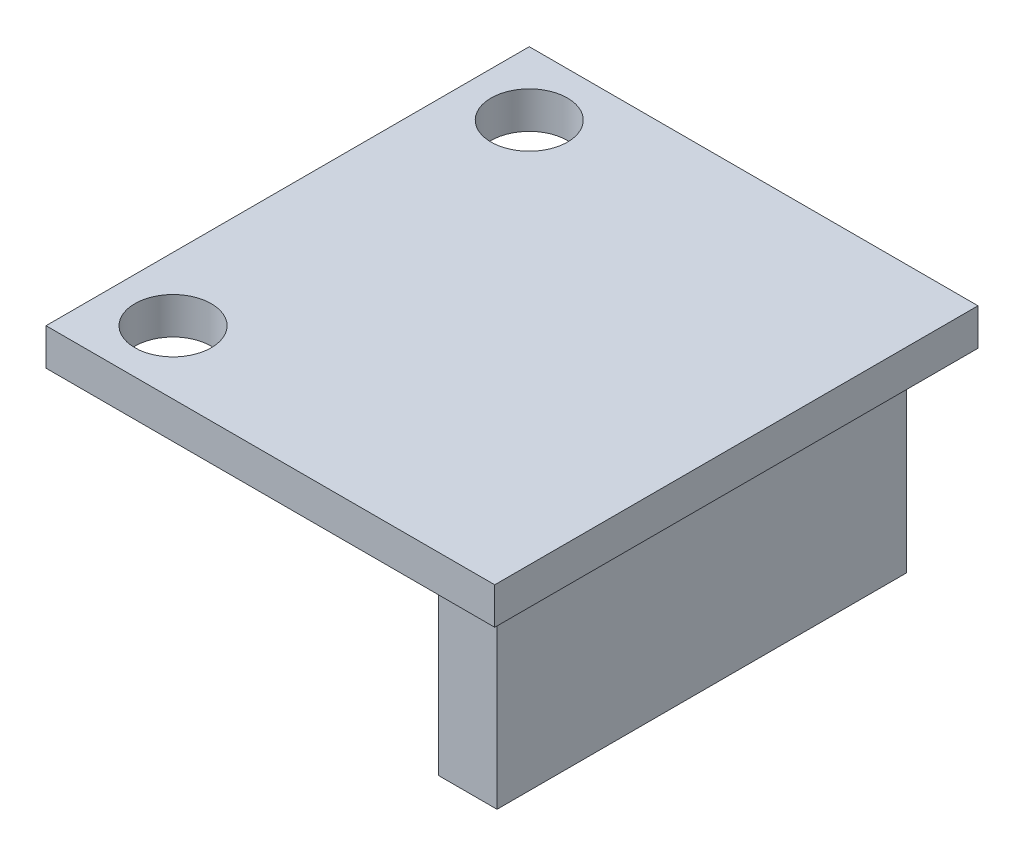
ISO-10303-21;
HEADER;
FILE_DESCRIPTION(('STEP AP214'),'2;1');
FILE_NAME('part.step','',(''),(''),'','','');
FILE_SCHEMA(('AUTOMOTIVE_DESIGN { 1 0 10303 214 1 1 1 1 }'));
ENDSEC;
DATA;
#1=APPLICATION_CONTEXT('core data for automotive mechanical design processes');
#2=APPLICATION_PROTOCOL_DEFINITION('international standard','automotive_design',2000,#1);
#3=PRODUCT_CONTEXT('',#1,'mechanical');
#4=PRODUCT('Part','Part','',(#3));
#5=PRODUCT_RELATED_PRODUCT_CATEGORY('part','',(#4));
#6=PRODUCT_DEFINITION_FORMATION('','',#4);
#7=PRODUCT_DEFINITION_CONTEXT('part definition',#1,'design');
#8=PRODUCT_DEFINITION('design','',#6,#7);
#9=PRODUCT_DEFINITION_SHAPE('','',#8);
#10=(LENGTH_UNIT() NAMED_UNIT(*) SI_UNIT(.MILLI.,.METRE.));
#11=(NAMED_UNIT(*) PLANE_ANGLE_UNIT() SI_UNIT($,.RADIAN.));
#12=(NAMED_UNIT(*) SI_UNIT($,.STERADIAN.) SOLID_ANGLE_UNIT());
#13=UNCERTAINTY_MEASURE_WITH_UNIT(LENGTH_MEASURE(1.E-05),#10,'distance_accuracy_value','');
#14=(GEOMETRIC_REPRESENTATION_CONTEXT(3) GLOBAL_UNCERTAINTY_ASSIGNED_CONTEXT((#13)) GLOBAL_UNIT_ASSIGNED_CONTEXT((#10,
#11,#12)) REPRESENTATION_CONTEXT('',''));
#15=CARTESIAN_POINT('',(0.,0.,0.));
#16=DIRECTION('',(0.,0.,1.));
#17=DIRECTION('',(1.,0.,0.));
#18=AXIS2_PLACEMENT_3D('',#15,#16,#17);
#19=CARTESIAN_POINT('',(-28.3332722708799,0.,-5.09343124696711));
#20=DIRECTION('',(0.,-1.,0.));
#21=DIRECTION('',(0.,0.,-1.));
#22=AXIS2_PLACEMENT_3D('',#19,#20,#21);
#23=PLANE('',#22);
#24=CARTESIAN_POINT('',(-25.5725722527087,0.,-2.33273122879591));
#25=DIRECTION('',(0.,1.,0.));
#26=DIRECTION('',(0.,0.,-1.));
#27=AXIS2_PLACEMENT_3D('',#24,#25,#26);
#28=CIRCLE('',#27,1.66070001817121);
#29=CARTESIAN_POINT('',(-25.5725722527087,0.,-3.99343124696712));
#30=VERTEX_POINT('',#29);
#31=EDGE_CURVE('E130',#30,#30,#28,.T.);
#32=ORIENTED_EDGE('',*,*,#31,.T.);
#33=EDGE_LOOP('',(#32));
#34=FACE_BOUND('',#33,.T.);
#35=DIRECTION('',(0.,0.,1.));
#36=VECTOR('',#35,1.);
#37=CARTESIAN_POINT('',(-28.3332722708799,0.,15.9065686630329));
#38=LINE('',#37,#36);
#39=CARTESIAN_POINT('',(-28.3332722708799,0.,-5.09343124696711));
#40=VERTEX_POINT('',#39);
#41=CARTESIAN_POINT('',(-28.3332722708799,0.,15.9065686630329));
#42=VERTEX_POINT('',#41);
#43=EDGE_CURVE('E144',#40,#42,#38,.T.);
#44=ORIENTED_EDGE('',*,*,#43,.F.);
#45=DIRECTION('',(-1.,0.,0.));
#46=VECTOR('',#45,1.);
#47=CARTESIAN_POINT('',(-28.3332722708799,0.,-5.09343124696711));
#48=LINE('',#47,#46);
#49=CARTESIAN_POINT('',(-8.83327227087986,0.,-5.09343124696711));
#50=VERTEX_POINT('',#49);
#51=EDGE_CURVE('E76',#50,#40,#48,.T.);
#52=ORIENTED_EDGE('',*,*,#51,.F.);
#53=DIRECTION('',(0.,0.,-1.));
#54=VECTOR('',#53,1.);
#55=CARTESIAN_POINT('',(-8.83327227087986,0.,15.9065686630329));
#56=LINE('',#55,#54);
#57=CARTESIAN_POINT('',(-8.83327227087986,0.,15.9065686630329));
#58=VERTEX_POINT('',#57);
#59=EDGE_CURVE('E158',#58,#50,#56,.T.);
#60=ORIENTED_EDGE('',*,*,#59,.F.);
#61=DIRECTION('',(1.,0.,0.));
#62=VECTOR('',#61,1.);
#63=CARTESIAN_POINT('',(-28.3332722708799,0.,15.9065686630329));
#64=LINE('',#63,#62);
#65=EDGE_CURVE('E156',#42,#58,#64,.T.);
#66=ORIENTED_EDGE('',*,*,#65,.F.);
#67=EDGE_LOOP('',(#44,#52,#60,#66));
#68=FACE_BOUND('',#67,.T.);
#69=CARTESIAN_POINT('',(-25.5725722527087,0.,13.1458686448617));
#70=DIRECTION('',(0.,1.,0.));
#71=DIRECTION('',(0.,0.,1.));
#72=AXIS2_PLACEMENT_3D('',#69,#70,#71);
#73=CIRCLE('',#72,1.66070001817121);
#74=CARTESIAN_POINT('',(-25.5725722527087,0.,14.8065686630329));
#75=VERTEX_POINT('',#74);
#76=EDGE_CURVE('E139',#75,#75,#73,.T.);
#77=ORIENTED_EDGE('',*,*,#76,.T.);
#78=EDGE_LOOP('',(#77));
#79=FACE_BOUND('',#78,.T.);
#80=DIRECTION('',(-1.,0.,0.));
#81=VECTOR('',#80,1.);
#82=CARTESIAN_POINT('',(-10.3332722708799,0.,14.3065687080329));
#83=LINE('',#82,#81);
#84=CARTESIAN_POINT('',(-10.3332722708799,0.,14.3065687080329));
#85=VERTEX_POINT('',#84);
#86=CARTESIAN_POINT('',(-12.8732722708799,0.,14.3065687080329));
#87=VERTEX_POINT('',#86);
#88=EDGE_CURVE('E296',#85,#87,#83,.T.);
#89=ORIENTED_EDGE('',*,*,#88,.F.);
#90=DIRECTION('',(0.,0.,1.));
#91=VECTOR('',#90,1.);
#92=CARTESIAN_POINT('',(-10.3332722708799,0.,14.3065687080329));
#93=LINE('',#92,#91);
#94=CARTESIAN_POINT('',(-10.3332722708799,0.,-3.49343129196711));
#95=VERTEX_POINT('',#94);
#96=EDGE_CURVE('E128',#95,#85,#93,.T.);
#97=ORIENTED_EDGE('',*,*,#96,.F.);
#98=DIRECTION('',(1.,0.,0.));
#99=VECTOR('',#98,1.);
#100=CARTESIAN_POINT('',(-10.3332722708799,0.,-3.49343129196711));
#101=LINE('',#100,#99);
#102=CARTESIAN_POINT('',(-12.8732722708799,0.,-3.49343129196711));
#103=VERTEX_POINT('',#102);
#104=EDGE_CURVE('E124',#103,#95,#101,.T.);
#105=ORIENTED_EDGE('',*,*,#104,.F.);
#106=DIRECTION('',(0.,0.,-1.));
#107=VECTOR('',#106,1.);
#108=CARTESIAN_POINT('',(-12.8732722708799,0.,14.3065687080329));
#109=LINE('',#108,#107);
#110=EDGE_CURVE('E293',#87,#103,#109,.T.);
#111=ORIENTED_EDGE('',*,*,#110,.F.);
#112=EDGE_LOOP('',(#89,#97,#105,#111));
#113=FACE_BOUND('',#112,.T.);
#114=ADVANCED_FACE('F31',(#34,#68,#79,#113),#23,.T.);
#115=CARTESIAN_POINT('',(-28.3332722708799,1.6,-5.09343124696711));
#116=DIRECTION('',(0.,-1.,0.));
#117=DIRECTION('',(0.,0.,-1.));
#118=AXIS2_PLACEMENT_3D('',#115,#116,#117);
#119=PLANE('',#118);
#120=CARTESIAN_POINT('',(-25.5725722527087,1.6,13.1458686448617));
#121=DIRECTION('',(0.,1.,0.));
#122=DIRECTION('',(0.,0.,1.));
#123=AXIS2_PLACEMENT_3D('',#120,#121,#122);
#124=CIRCLE('',#123,1.66070001817121);
#125=CARTESIAN_POINT('',(-25.5725722527087,1.6,14.8065686630329));
#126=VERTEX_POINT('',#125);
#127=EDGE_CURVE('E141',#126,#126,#124,.T.);
#128=ORIENTED_EDGE('',*,*,#127,.F.);
#129=EDGE_LOOP('',(#128));
#130=FACE_BOUND('',#129,.T.);
#131=DIRECTION('',(0.,0.,1.));
#132=VECTOR('',#131,1.);
#133=CARTESIAN_POINT('',(-28.3332722708799,1.6,15.9065686630329));
#134=LINE('',#133,#132);
#135=CARTESIAN_POINT('',(-28.3332722708799,1.6,-5.09343124696711));
#136=VERTEX_POINT('',#135);
#137=CARTESIAN_POINT('',(-28.3332722708799,1.6,15.9065686630329));
#138=VERTEX_POINT('',#137);
#139=EDGE_CURVE('E147',#136,#138,#134,.T.);
#140=ORIENTED_EDGE('',*,*,#139,.T.);
#141=DIRECTION('',(1.,0.,0.));
#142=VECTOR('',#141,1.);
#143=CARTESIAN_POINT('',(-28.3332722708799,1.6,15.9065686630329));
#144=LINE('',#143,#142);
#145=CARTESIAN_POINT('',(-8.83327227087986,1.6,15.9065686630329));
#146=VERTEX_POINT('',#145);
#147=EDGE_CURVE('E83',#138,#146,#144,.T.);
#148=ORIENTED_EDGE('',*,*,#147,.T.);
#149=DIRECTION('',(0.,0.,-1.));
#150=VECTOR('',#149,1.);
#151=CARTESIAN_POINT('',(-8.83327227087986,1.6,15.9065686630329));
#152=LINE('',#151,#150);
#153=CARTESIAN_POINT('',(-8.83327227087986,1.6,-5.09343124696711));
#154=VERTEX_POINT('',#153);
#155=EDGE_CURVE('E150',#146,#154,#152,.T.);
#156=ORIENTED_EDGE('',*,*,#155,.T.);
#157=DIRECTION('',(-1.,0.,0.));
#158=VECTOR('',#157,1.);
#159=CARTESIAN_POINT('',(-28.3332722708799,1.6,-5.09343124696711));
#160=LINE('',#159,#158);
#161=EDGE_CURVE('E55',#154,#136,#160,.T.);
#162=ORIENTED_EDGE('',*,*,#161,.T.);
#163=EDGE_LOOP('',(#140,#148,#156,#162));
#164=FACE_BOUND('',#163,.T.);
#165=CARTESIAN_POINT('',(-25.5725722527087,1.6,-2.33273122879591));
#166=DIRECTION('',(0.,1.,0.));
#167=DIRECTION('',(0.,0.,-1.));
#168=AXIS2_PLACEMENT_3D('',#165,#166,#167);
#169=CIRCLE('',#168,1.66070001817121);
#170=CARTESIAN_POINT('',(-25.5725722527087,1.6,-3.99343124696712));
#171=VERTEX_POINT('',#170);
#172=EDGE_CURVE('E133',#171,#171,#169,.T.);
#173=ORIENTED_EDGE('',*,*,#172,.F.);
#174=EDGE_LOOP('',(#173));
#175=FACE_BOUND('',#174,.T.);
#176=ADVANCED_FACE('F190',(#130,#164,#175),#119,.F.);
#177=CARTESIAN_POINT('',(-28.3332722708799,1.6,15.9065686630329));
#178=DIRECTION('',(1.,0.,0.));
#179=DIRECTION('',(0.,0.,-1.));
#180=AXIS2_PLACEMENT_3D('',#177,#178,#179);
#181=PLANE('',#180);
#182=ORIENTED_EDGE('',*,*,#43,.T.);
#183=DIRECTION('',(0.,-1.,0.));
#184=VECTOR('',#183,1.);
#185=CARTESIAN_POINT('',(-28.3332722708799,1.6,15.9065686630329));
#186=LINE('',#185,#184);
#187=EDGE_CURVE('E11',#138,#42,#186,.T.);
#188=ORIENTED_EDGE('',*,*,#187,.F.);
#189=ORIENTED_EDGE('',*,*,#139,.F.);
#190=DIRECTION('',(0.,-1.,0.));
#191=VECTOR('',#190,1.);
#192=CARTESIAN_POINT('',(-28.3332722708799,1.6,-5.09343124696711));
#193=LINE('',#192,#191);
#194=EDGE_CURVE('E153',#136,#40,#193,.T.);
#195=ORIENTED_EDGE('',*,*,#194,.T.);
#196=EDGE_LOOP('',(#182,#188,#189,#195));
#197=FACE_BOUND('',#196,.T.);
#198=ADVANCED_FACE('F33',(#197),#181,.F.);
#199=CARTESIAN_POINT('',(-28.3332722708799,1.6,15.9065686630329));
#200=DIRECTION('',(0.,0.,-1.));
#201=DIRECTION('',(-1.,0.,0.));
#202=AXIS2_PLACEMENT_3D('',#199,#200,#201);
#203=PLANE('',#202);
#204=ORIENTED_EDGE('',*,*,#65,.T.);
#205=DIRECTION('',(0.,-1.,0.));
#206=VECTOR('',#205,1.);
#207=CARTESIAN_POINT('',(-8.83327227087986,1.6,15.9065686630329));
#208=LINE('',#207,#206);
#209=EDGE_CURVE('E39',#146,#58,#208,.T.);
#210=ORIENTED_EDGE('',*,*,#209,.F.);
#211=ORIENTED_EDGE('',*,*,#147,.F.);
#212=ORIENTED_EDGE('',*,*,#187,.T.);
#213=EDGE_LOOP('',(#204,#210,#211,#212));
#214=FACE_BOUND('',#213,.T.);
#215=ADVANCED_FACE('F186',(#214),#203,.F.);
#216=CARTESIAN_POINT('',(-8.83327227087986,1.6,15.9065686630329));
#217=DIRECTION('',(-1.,0.,0.));
#218=DIRECTION('',(0.,0.,1.));
#219=AXIS2_PLACEMENT_3D('',#216,#217,#218);
#220=PLANE('',#219);
#221=ORIENTED_EDGE('',*,*,#59,.T.);
#222=DIRECTION('',(0.,-1.,0.));
#223=VECTOR('',#222,1.);
#224=CARTESIAN_POINT('',(-8.83327227087986,1.6,-5.09343124696711));
#225=LINE('',#224,#223);
#226=EDGE_CURVE('E162',#154,#50,#225,.T.);
#227=ORIENTED_EDGE('',*,*,#226,.F.);
#228=ORIENTED_EDGE('',*,*,#155,.F.);
#229=ORIENTED_EDGE('',*,*,#209,.T.);
#230=EDGE_LOOP('',(#221,#227,#228,#229));
#231=FACE_BOUND('',#230,.T.);
#232=ADVANCED_FACE('F167',(#231),#220,.F.);
#233=CARTESIAN_POINT('',(-28.3332722708799,1.6,-5.09343124696711));
#234=DIRECTION('',(0.,0.,1.));
#235=DIRECTION('',(1.,0.,0.));
#236=AXIS2_PLACEMENT_3D('',#233,#234,#235);
#237=PLANE('',#236);
#238=ORIENTED_EDGE('',*,*,#51,.T.);
#239=ORIENTED_EDGE('',*,*,#194,.F.);
#240=ORIENTED_EDGE('',*,*,#161,.F.);
#241=ORIENTED_EDGE('',*,*,#226,.T.);
#242=EDGE_LOOP('',(#238,#239,#240,#241));
#243=FACE_BOUND('',#242,.T.);
#244=ADVANCED_FACE('F175',(#243),#237,.F.);
#245=CARTESIAN_POINT('',(-25.5725722527087,1.6,13.1458686448617));
#246=DIRECTION('',(0.,-1.,0.));
#247=DIRECTION('',(0.,0.,-1.));
#248=AXIS2_PLACEMENT_3D('',#245,#246,#247);
#249=CYLINDRICAL_SURFACE('',#248,1.66070001817121);
#250=ORIENTED_EDGE('',*,*,#127,.T.);
#251=EDGE_LOOP('',(#250));
#252=FACE_BOUND('',#251,.T.);
#253=ORIENTED_EDGE('',*,*,#76,.F.);
#254=EDGE_LOOP('',(#253));
#255=FACE_BOUND('',#254,.T.);
#256=ADVANCED_FACE('F177',(#252,#255),#249,.F.);
#257=CARTESIAN_POINT('',(-25.5725722527087,1.6,-2.33273122879591));
#258=DIRECTION('',(0.,-1.,0.));
#259=DIRECTION('',(0.,0.,-1.));
#260=AXIS2_PLACEMENT_3D('',#257,#258,#259);
#261=CYLINDRICAL_SURFACE('',#260,1.66070001817121);
#262=ORIENTED_EDGE('',*,*,#172,.T.);
#263=EDGE_LOOP('',(#262));
#264=FACE_BOUND('',#263,.T.);
#265=ORIENTED_EDGE('',*,*,#31,.F.);
#266=EDGE_LOOP('',(#265));
#267=FACE_BOUND('',#266,.T.);
#268=ADVANCED_FACE('F183',(#264,#267),#261,.F.);
#269=CARTESIAN_POINT('',(-10.3332722708799,-8.4,14.3065687080329));
#270=DIRECTION('',(-1.,0.,0.));
#271=DIRECTION('',(0.,0.,1.));
#272=AXIS2_PLACEMENT_3D('',#269,#270,#271);
#273=PLANE('',#272);
#274=ORIENTED_EDGE('',*,*,#96,.T.);
#275=DIRECTION('',(0.,1.,0.));
#276=VECTOR('',#275,1.);
#277=CARTESIAN_POINT('',(-10.3332722708799,-8.4,14.3065687080329));
#278=LINE('',#277,#276);
#279=CARTESIAN_POINT('',(-10.3332722708799,-8.4,14.3065687080329));
#280=VERTEX_POINT('',#279);
#281=EDGE_CURVE('E109',#280,#85,#278,.T.);
#282=ORIENTED_EDGE('',*,*,#281,.F.);
#283=DIRECTION('',(0.,0.,1.));
#284=VECTOR('',#283,1.);
#285=CARTESIAN_POINT('',(-10.3332722708799,-8.4,14.3065687080329));
#286=LINE('',#285,#284);
#287=CARTESIAN_POINT('',(-10.3332722708799,-8.4,-3.49343129196711));
#288=VERTEX_POINT('',#287);
#289=EDGE_CURVE('E116',#288,#280,#286,.T.);
#290=ORIENTED_EDGE('',*,*,#289,.F.);
#291=DIRECTION('',(0.,1.,0.));
#292=VECTOR('',#291,1.);
#293=CARTESIAN_POINT('',(-10.3332722708799,-8.4,-3.49343129196711));
#294=LINE('',#293,#292);
#295=EDGE_CURVE('E290',#288,#95,#294,.T.);
#296=ORIENTED_EDGE('',*,*,#295,.T.);
#297=EDGE_LOOP('',(#274,#282,#290,#296));
#298=FACE_BOUND('',#297,.T.);
#299=ADVANCED_FACE('F126',(#298),#273,.F.);
#300=CARTESIAN_POINT('',(-10.3332722708799,-8.4,14.3065687080329));
#301=DIRECTION('',(0.,0.,-1.));
#302=DIRECTION('',(-1.,0.,0.));
#303=AXIS2_PLACEMENT_3D('',#300,#301,#302);
#304=PLANE('',#303);
#305=ORIENTED_EDGE('',*,*,#88,.T.);
#306=DIRECTION('',(0.,1.,0.));
#307=VECTOR('',#306,1.);
#308=CARTESIAN_POINT('',(-12.8732722708799,-8.4,14.3065687080329));
#309=LINE('',#308,#307);
#310=CARTESIAN_POINT('',(-12.8732722708799,-8.4,14.3065687080329));
#311=VERTEX_POINT('',#310);
#312=EDGE_CURVE('E112',#311,#87,#309,.T.);
#313=ORIENTED_EDGE('',*,*,#312,.F.);
#314=DIRECTION('',(-1.,0.,0.));
#315=VECTOR('',#314,1.);
#316=CARTESIAN_POINT('',(-10.3332722708799,-8.4,14.3065687080329));
#317=LINE('',#316,#315);
#318=EDGE_CURVE('E105',#280,#311,#317,.T.);
#319=ORIENTED_EDGE('',*,*,#318,.F.);
#320=ORIENTED_EDGE('',*,*,#281,.T.);
#321=EDGE_LOOP('',(#305,#313,#319,#320));
#322=FACE_BOUND('',#321,.T.);
#323=ADVANCED_FACE('F107',(#322),#304,.F.);
#324=CARTESIAN_POINT('',(-12.8732722708799,-8.4,14.3065687080329));
#325=DIRECTION('',(1.,0.,0.));
#326=DIRECTION('',(0.,0.,-1.));
#327=AXIS2_PLACEMENT_3D('',#324,#325,#326);
#328=PLANE('',#327);
#329=ORIENTED_EDGE('',*,*,#110,.T.);
#330=DIRECTION('',(0.,1.,0.));
#331=VECTOR('',#330,1.);
#332=CARTESIAN_POINT('',(-12.8732722708799,-8.4,-3.49343129196711));
#333=LINE('',#332,#331);
#334=CARTESIAN_POINT('',(-12.8732722708799,-8.4,-3.49343129196711));
#335=VERTEX_POINT('',#334);
#336=EDGE_CURVE('E46',#335,#103,#333,.T.);
#337=ORIENTED_EDGE('',*,*,#336,.F.);
#338=DIRECTION('',(0.,0.,-1.));
#339=VECTOR('',#338,1.);
#340=CARTESIAN_POINT('',(-12.8732722708799,-8.4,14.3065687080329));
#341=LINE('',#340,#339);
#342=EDGE_CURVE('E115',#311,#335,#341,.T.);
#343=ORIENTED_EDGE('',*,*,#342,.F.);
#344=ORIENTED_EDGE('',*,*,#312,.T.);
#345=EDGE_LOOP('',(#329,#337,#343,#344));
#346=FACE_BOUND('',#345,.T.);
#347=ADVANCED_FACE('F205',(#346),#328,.F.);
#348=CARTESIAN_POINT('',(-10.3332722708799,-8.4,-3.49343129196711));
#349=DIRECTION('',(0.,0.,1.));
#350=DIRECTION('',(1.,0.,0.));
#351=AXIS2_PLACEMENT_3D('',#348,#349,#350);
#352=PLANE('',#351);
#353=ORIENTED_EDGE('',*,*,#104,.T.);
#354=ORIENTED_EDGE('',*,*,#295,.F.);
#355=DIRECTION('',(1.,0.,0.));
#356=VECTOR('',#355,1.);
#357=CARTESIAN_POINT('',(-10.3332722708799,-8.4,-3.49343129196711));
#358=LINE('',#357,#356);
#359=EDGE_CURVE('E120',#335,#288,#358,.T.);
#360=ORIENTED_EDGE('',*,*,#359,.F.);
#361=ORIENTED_EDGE('',*,*,#336,.T.);
#362=EDGE_LOOP('',(#353,#354,#360,#361));
#363=FACE_BOUND('',#362,.T.);
#364=ADVANCED_FACE('F208',(#363),#352,.F.);
#365=CARTESIAN_POINT('',(-10.3332722708799,-8.4,-3.49343129196711));
#366=DIRECTION('',(0.,1.,0.));
#367=DIRECTION('',(0.,0.,1.));
#368=AXIS2_PLACEMENT_3D('',#365,#366,#367);
#369=PLANE('',#368);
#370=ORIENTED_EDGE('',*,*,#289,.T.);
#371=ORIENTED_EDGE('',*,*,#318,.T.);
#372=ORIENTED_EDGE('',*,*,#342,.T.);
#373=ORIENTED_EDGE('',*,*,#359,.T.);
#374=EDGE_LOOP('',(#370,#371,#372,#373));
#375=FACE_BOUND('',#374,.T.);
#376=ADVANCED_FACE('F119',(#375),#369,.F.);
#377=CLOSED_SHELL('',(#114,#176,#198,#215,#232,#244,#256,#268,#299,#323,#347,#364,#376));
#378=MANIFOLD_SOLID_BREP('B2',#377);
#379=ADVANCED_BREP_SHAPE_REPRESENTATION('',(#18,#378),#14);
#380=SHAPE_DEFINITION_REPRESENTATION(#9,#379);
ENDSEC;
END-ISO-10303-21;
